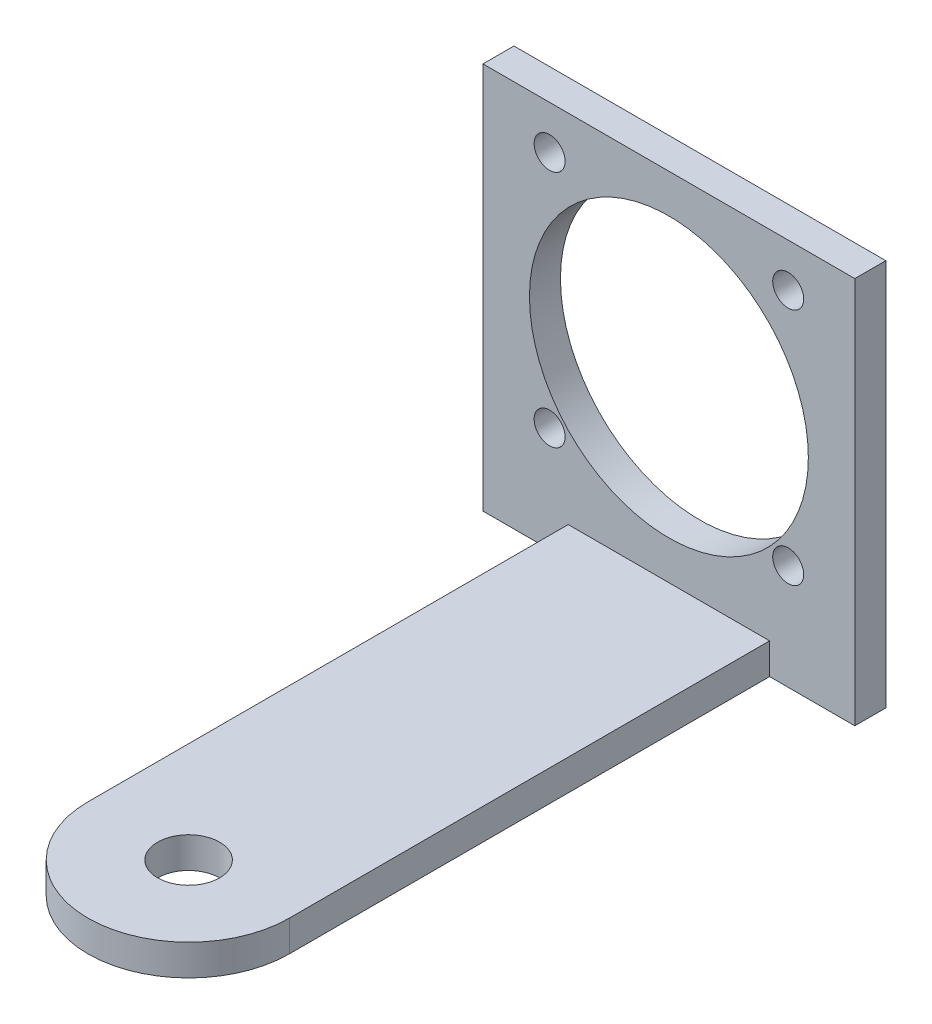
ISO-10303-21;
HEADER;
FILE_DESCRIPTION(('STEP AP214'),'2;1');
FILE_NAME('part.step','',(''),(''),'','','');
FILE_SCHEMA(('AUTOMOTIVE_DESIGN { 1 0 10303 214 1 1 1 1 }'));
ENDSEC;
DATA;
#1=APPLICATION_CONTEXT('core data for automotive mechanical design processes');
#2=APPLICATION_PROTOCOL_DEFINITION('international standard','automotive_design',2000,#1);
#3=PRODUCT_CONTEXT('',#1,'mechanical');
#4=PRODUCT('Part','Part','',(#3));
#5=PRODUCT_RELATED_PRODUCT_CATEGORY('part','',(#4));
#6=PRODUCT_DEFINITION_FORMATION('','',#4);
#7=PRODUCT_DEFINITION_CONTEXT('part definition',#1,'design');
#8=PRODUCT_DEFINITION('design','',#6,#7);
#9=PRODUCT_DEFINITION_SHAPE('','',#8);
#10=(LENGTH_UNIT() NAMED_UNIT(*) SI_UNIT(.MILLI.,.METRE.));
#11=(NAMED_UNIT(*) PLANE_ANGLE_UNIT() SI_UNIT($,.RADIAN.));
#12=(NAMED_UNIT(*) SI_UNIT($,.STERADIAN.) SOLID_ANGLE_UNIT());
#13=UNCERTAINTY_MEASURE_WITH_UNIT(LENGTH_MEASURE(1.E-05),#10,'distance_accuracy_value','');
#14=(GEOMETRIC_REPRESENTATION_CONTEXT(3) GLOBAL_UNCERTAINTY_ASSIGNED_CONTEXT((#13)) GLOBAL_UNIT_ASSIGNED_CONTEXT((#10,
#11,#12)) REPRESENTATION_CONTEXT('',''));
#15=CARTESIAN_POINT('',(0.,0.,0.));
#16=DIRECTION('',(0.,0.,1.));
#17=DIRECTION('',(1.,0.,0.));
#18=AXIS2_PLACEMENT_3D('',#15,#16,#17);
#19=CARTESIAN_POINT('',(0.,2.,0.));
#20=DIRECTION('',(0.,-1.,0.));
#21=DIRECTION('',(0.,0.,-1.));
#22=AXIS2_PLACEMENT_3D('',#19,#20,#21);
#23=CYLINDRICAL_SURFACE('',#22,6.5);
#24=DIRECTION('',(0.,1.,0.));
#25=VECTOR('',#24,1.);
#26=CARTESIAN_POINT('',(6.5,0.,0.));
#27=LINE('',#26,#25);
#28=CARTESIAN_POINT('',(6.5,0.,0.));
#29=VERTEX_POINT('',#28);
#30=CARTESIAN_POINT('',(6.5,2.,0.));
#31=VERTEX_POINT('',#30);
#32=EDGE_CURVE('E85',#29,#31,#27,.T.);
#33=ORIENTED_EDGE('',*,*,#32,.T.);
#34=CARTESIAN_POINT('',(0.,2.,0.));
#35=DIRECTION('',(0.,1.,0.));
#36=DIRECTION('',(0.,0.,1.));
#37=AXIS2_PLACEMENT_3D('',#34,#35,#36);
#38=CIRCLE('',#37,6.5);
#39=CARTESIAN_POINT('',(-6.5,2.,0.));
#40=VERTEX_POINT('',#39);
#41=EDGE_CURVE('E12',#40,#31,#38,.T.);
#42=ORIENTED_EDGE('',*,*,#41,.F.);
#43=DIRECTION('',(0.,1.,0.));
#44=VECTOR('',#43,1.);
#45=CARTESIAN_POINT('',(-6.5,0.,0.));
#46=LINE('',#45,#44);
#47=CARTESIAN_POINT('',(-6.5,0.,0.));
#48=VERTEX_POINT('',#47);
#49=EDGE_CURVE('E211',#48,#40,#46,.T.);
#50=ORIENTED_EDGE('',*,*,#49,.F.);
#51=CARTESIAN_POINT('',(0.,0.,0.));
#52=DIRECTION('',(0.,1.,0.));
#53=DIRECTION('',(0.,0.,1.));
#54=AXIS2_PLACEMENT_3D('',#51,#52,#53);
#55=CIRCLE('',#54,6.5);
#56=EDGE_CURVE('E70',#48,#29,#55,.T.);
#57=ORIENTED_EDGE('',*,*,#56,.T.);
#58=EDGE_LOOP('',(#33,#42,#50,#57));
#59=FACE_BOUND('',#58,.T.);
#60=ADVANCED_FACE('F67',(#59),#23,.T.);
#61=CARTESIAN_POINT('',(0.,2.,0.));
#62=DIRECTION('',(0.,1.,0.));
#63=DIRECTION('',(0.,0.,1.));
#64=AXIS2_PLACEMENT_3D('',#61,#62,#63);
#65=PLANE('',#64);
#66=CARTESIAN_POINT('',(0.,2.,0.));
#67=DIRECTION('',(0.,1.,0.));
#68=DIRECTION('',(0.,0.,1.));
#69=AXIS2_PLACEMENT_3D('',#66,#67,#68);
#70=CIRCLE('',#69,2.);
#71=CARTESIAN_POINT('',(0.,2.,2.));
#72=VERTEX_POINT('',#71);
#73=EDGE_CURVE('E208',#72,#72,#70,.T.);
#74=ORIENTED_EDGE('',*,*,#73,.F.);
#75=EDGE_LOOP('',(#74));
#76=FACE_BOUND('',#75,.T.);
#77=ORIENTED_EDGE('',*,*,#41,.T.);
#78=DIRECTION('',(0.,0.,-1.));
#79=VECTOR('',#78,1.);
#80=CARTESIAN_POINT('',(6.5,2.,0.));
#81=LINE('',#80,#79);
#82=CARTESIAN_POINT('',(6.5,2.,-31.));
#83=VERTEX_POINT('',#82);
#84=EDGE_CURVE('E191',#31,#83,#81,.T.);
#85=ORIENTED_EDGE('',*,*,#84,.T.);
#86=DIRECTION('',(1.,0.,0.));
#87=VECTOR('',#86,1.);
#88=CARTESIAN_POINT('',(0.,2.,-31.));
#89=LINE('',#88,#87);
#90=CARTESIAN_POINT('',(-6.5,2.,-31.));
#91=VERTEX_POINT('',#90);
#92=EDGE_CURVE('E150',#91,#83,#89,.T.);
#93=ORIENTED_EDGE('',*,*,#92,.F.);
#94=DIRECTION('',(0.,0.,-1.));
#95=VECTOR('',#94,1.);
#96=CARTESIAN_POINT('',(-6.5,2.,0.));
#97=LINE('',#96,#95);
#98=EDGE_CURVE('E198',#40,#91,#97,.T.);
#99=ORIENTED_EDGE('',*,*,#98,.F.);
#100=EDGE_LOOP('',(#77,#85,#93,#99));
#101=FACE_BOUND('',#100,.T.);
#102=ADVANCED_FACE('F227',(#76,#101),#65,.T.);
#103=CARTESIAN_POINT('',(0.,0.,0.));
#104=DIRECTION('',(0.,1.,0.));
#105=DIRECTION('',(0.,0.,1.));
#106=AXIS2_PLACEMENT_3D('',#103,#104,#105);
#107=PLANE('',#106);
#108=CARTESIAN_POINT('',(0.,0.,0.));
#109=DIRECTION('',(0.,1.,0.));
#110=DIRECTION('',(0.,0.,1.));
#111=AXIS2_PLACEMENT_3D('',#108,#109,#110);
#112=CIRCLE('',#111,2.);
#113=CARTESIAN_POINT('',(0.,0.,2.));
#114=VERTEX_POINT('',#113);
#115=EDGE_CURVE('E217',#114,#114,#112,.T.);
#116=ORIENTED_EDGE('',*,*,#115,.T.);
#117=EDGE_LOOP('',(#116));
#118=FACE_BOUND('',#117,.T.);
#119=ORIENTED_EDGE('',*,*,#56,.F.);
#120=DIRECTION('',(0.,0.,-1.));
#121=VECTOR('',#120,1.);
#122=CARTESIAN_POINT('',(-6.5,0.,0.));
#123=LINE('',#122,#121);
#124=CARTESIAN_POINT('',(-6.5,0.,-31.));
#125=VERTEX_POINT('',#124);
#126=EDGE_CURVE('E187',#48,#125,#123,.T.);
#127=ORIENTED_EDGE('',*,*,#126,.T.);
#128=DIRECTION('',(-1.,0.,0.));
#129=VECTOR('',#128,1.);
#130=CARTESIAN_POINT('',(0.,0.,-31.));
#131=LINE('',#130,#129);
#132=CARTESIAN_POINT('',(-12.,0.,-31.));
#133=VERTEX_POINT('',#132);
#134=EDGE_CURVE('E146',#125,#133,#131,.T.);
#135=ORIENTED_EDGE('',*,*,#134,.T.);
#136=DIRECTION('',(0.,0.,1.));
#137=VECTOR('',#136,1.);
#138=CARTESIAN_POINT('',(-12.,0.,-33.));
#139=LINE('',#138,#137);
#140=CARTESIAN_POINT('',(-12.,0.,-33.));
#141=VERTEX_POINT('',#140);
#142=EDGE_CURVE('E143',#141,#133,#139,.T.);
#143=ORIENTED_EDGE('',*,*,#142,.F.);
#144=DIRECTION('',(-1.,0.,0.));
#145=VECTOR('',#144,1.);
#146=CARTESIAN_POINT('',(12.,0.,-33.));
#147=LINE('',#146,#145);
#148=CARTESIAN_POINT('',(12.,0.,-33.));
#149=VERTEX_POINT('',#148);
#150=EDGE_CURVE('E128',#149,#141,#147,.T.);
#151=ORIENTED_EDGE('',*,*,#150,.F.);
#152=DIRECTION('',(0.,0.,1.));
#153=VECTOR('',#152,1.);
#154=CARTESIAN_POINT('',(12.,0.,-33.));
#155=LINE('',#154,#153);
#156=CARTESIAN_POINT('',(12.,0.,-31.));
#157=VERTEX_POINT('',#156);
#158=EDGE_CURVE('E165',#149,#157,#155,.T.);
#159=ORIENTED_EDGE('',*,*,#158,.T.);
#160=CARTESIAN_POINT('',(6.5,0.,-31.));
#161=VERTEX_POINT('',#160);
#162=EDGE_CURVE('E166',#157,#161,#131,.T.);
#163=ORIENTED_EDGE('',*,*,#162,.T.);
#164=DIRECTION('',(0.,0.,-1.));
#165=VECTOR('',#164,1.);
#166=CARTESIAN_POINT('',(6.5,0.,0.));
#167=LINE('',#166,#165);
#168=EDGE_CURVE('E190',#29,#161,#167,.T.);
#169=ORIENTED_EDGE('',*,*,#168,.F.);
#170=EDGE_LOOP('',(#119,#127,#135,#143,#151,#159,#163,#169));
#171=FACE_BOUND('',#170,.T.);
#172=ADVANCED_FACE('F144',(#118,#171),#107,.F.);
#173=CARTESIAN_POINT('',(0.,0.,0.));
#174=DIRECTION('',(0.,1.,0.));
#175=DIRECTION('',(0.,0.,1.));
#176=AXIS2_PLACEMENT_3D('',#173,#174,#175);
#177=CYLINDRICAL_SURFACE('',#176,2.);
#178=ORIENTED_EDGE('',*,*,#115,.F.);
#179=EDGE_LOOP('',(#178));
#180=FACE_BOUND('',#179,.T.);
#181=ORIENTED_EDGE('',*,*,#73,.T.);
#182=EDGE_LOOP('',(#181));
#183=FACE_BOUND('',#182,.T.);
#184=ADVANCED_FACE('F225',(#180,#183),#177,.F.);
#185=CARTESIAN_POINT('',(6.5,0.,0.));
#186=DIRECTION('',(1.,0.,0.));
#187=DIRECTION('',(0.,0.,-1.));
#188=AXIS2_PLACEMENT_3D('',#185,#186,#187);
#189=PLANE('',#188);
#190=ORIENTED_EDGE('',*,*,#84,.F.);
#191=ORIENTED_EDGE('',*,*,#32,.F.);
#192=ORIENTED_EDGE('',*,*,#168,.T.);
#193=DIRECTION('',(0.,1.,0.));
#194=VECTOR('',#193,1.);
#195=CARTESIAN_POINT('',(6.5,0.,-31.));
#196=LINE('',#195,#194);
#197=EDGE_CURVE('E205',#161,#83,#196,.T.);
#198=ORIENTED_EDGE('',*,*,#197,.T.);
#199=EDGE_LOOP('',(#190,#191,#192,#198));
#200=FACE_BOUND('',#199,.T.);
#201=ADVANCED_FACE('F234',(#200),#189,.T.);
#202=CARTESIAN_POINT('',(-6.5,0.,0.));
#203=DIRECTION('',(1.,0.,0.));
#204=DIRECTION('',(0.,0.,-1.));
#205=AXIS2_PLACEMENT_3D('',#202,#203,#204);
#206=PLANE('',#205);
#207=ORIENTED_EDGE('',*,*,#98,.T.);
#208=DIRECTION('',(0.,1.,0.));
#209=VECTOR('',#208,1.);
#210=CARTESIAN_POINT('',(-6.5,0.,-31.));
#211=LINE('',#210,#209);
#212=EDGE_CURVE('E194',#125,#91,#211,.T.);
#213=ORIENTED_EDGE('',*,*,#212,.F.);
#214=ORIENTED_EDGE('',*,*,#126,.F.);
#215=ORIENTED_EDGE('',*,*,#49,.T.);
#216=EDGE_LOOP('',(#207,#213,#214,#215));
#217=FACE_BOUND('',#216,.T.);
#218=ADVANCED_FACE('F253',(#217),#206,.F.);
#219=CARTESIAN_POINT('',(-12.,0.,-33.));
#220=DIRECTION('',(1.,0.,0.));
#221=DIRECTION('',(0.,0.,-1.));
#222=AXIS2_PLACEMENT_3D('',#219,#220,#221);
#223=PLANE('',#222);
#224=DIRECTION('',(0.,1.,0.));
#225=VECTOR('',#224,1.);
#226=CARTESIAN_POINT('',(-12.,0.,-31.));
#227=LINE('',#226,#225);
#228=CARTESIAN_POINT('',(-12.,25.,-31.));
#229=VERTEX_POINT('',#228);
#230=EDGE_CURVE('E170',#133,#229,#227,.T.);
#231=ORIENTED_EDGE('',*,*,#230,.T.);
#232=DIRECTION('',(0.,0.,1.));
#233=VECTOR('',#232,1.);
#234=CARTESIAN_POINT('',(-12.,25.,-33.));
#235=LINE('',#234,#233);
#236=CARTESIAN_POINT('',(-12.,25.,-33.));
#237=VERTEX_POINT('',#236);
#238=EDGE_CURVE('E151',#237,#229,#235,.T.);
#239=ORIENTED_EDGE('',*,*,#238,.F.);
#240=DIRECTION('',(0.,1.,0.));
#241=VECTOR('',#240,1.);
#242=CARTESIAN_POINT('',(-12.,0.,-33.));
#243=LINE('',#242,#241);
#244=EDGE_CURVE('E132',#141,#237,#243,.T.);
#245=ORIENTED_EDGE('',*,*,#244,.F.);
#246=ORIENTED_EDGE('',*,*,#142,.T.);
#247=EDGE_LOOP('',(#231,#239,#245,#246));
#248=FACE_BOUND('',#247,.T.);
#249=ADVANCED_FACE('F153',(#248),#223,.F.);
#250=CARTESIAN_POINT('',(-12.,25.,-33.));
#251=DIRECTION('',(0.,-1.,0.));
#252=DIRECTION('',(1.,0.,0.));
#253=AXIS2_PLACEMENT_3D('',#250,#251,#252);
#254=PLANE('',#253);
#255=DIRECTION('',(1.,0.,0.));
#256=VECTOR('',#255,1.);
#257=CARTESIAN_POINT('',(-12.,25.,-31.));
#258=LINE('',#257,#256);
#259=CARTESIAN_POINT('',(12.,25.,-31.));
#260=VERTEX_POINT('',#259);
#261=EDGE_CURVE('E173',#229,#260,#258,.T.);
#262=ORIENTED_EDGE('',*,*,#261,.T.);
#263=DIRECTION('',(0.,0.,1.));
#264=VECTOR('',#263,1.);
#265=CARTESIAN_POINT('',(12.,25.,-33.));
#266=LINE('',#265,#264);
#267=CARTESIAN_POINT('',(12.,25.,-33.));
#268=VERTEX_POINT('',#267);
#269=EDGE_CURVE('E181',#268,#260,#266,.T.);
#270=ORIENTED_EDGE('',*,*,#269,.F.);
#271=DIRECTION('',(1.,0.,0.));
#272=VECTOR('',#271,1.);
#273=CARTESIAN_POINT('',(-12.,25.,-33.));
#274=LINE('',#273,#272);
#275=EDGE_CURVE('E157',#237,#268,#274,.T.);
#276=ORIENTED_EDGE('',*,*,#275,.F.);
#277=ORIENTED_EDGE('',*,*,#238,.T.);
#278=EDGE_LOOP('',(#262,#270,#276,#277));
#279=FACE_BOUND('',#278,.T.);
#280=ADVANCED_FACE('F245',(#279),#254,.F.);
#281=CARTESIAN_POINT('',(12.,25.,-33.));
#282=DIRECTION('',(-1.,0.,0.));
#283=DIRECTION('',(0.,0.,1.));
#284=AXIS2_PLACEMENT_3D('',#281,#282,#283);
#285=PLANE('',#284);
#286=DIRECTION('',(0.,-1.,0.));
#287=VECTOR('',#286,1.);
#288=CARTESIAN_POINT('',(12.,25.,-31.));
#289=LINE('',#288,#287);
#290=EDGE_CURVE('E140',#260,#157,#289,.T.);
#291=ORIENTED_EDGE('',*,*,#290,.T.);
#292=ORIENTED_EDGE('',*,*,#158,.F.);
#293=DIRECTION('',(0.,-1.,0.));
#294=VECTOR('',#293,1.);
#295=CARTESIAN_POINT('',(12.,25.,-33.));
#296=LINE('',#295,#294);
#297=EDGE_CURVE('E135',#268,#149,#296,.T.);
#298=ORIENTED_EDGE('',*,*,#297,.F.);
#299=ORIENTED_EDGE('',*,*,#269,.T.);
#300=EDGE_LOOP('',(#291,#292,#298,#299));
#301=FACE_BOUND('',#300,.T.);
#302=ADVANCED_FACE('F241',(#301),#285,.F.);
#303=CARTESIAN_POINT('',(0.,0.,-33.));
#304=DIRECTION('',(0.,0.,-1.));
#305=DIRECTION('',(-1.,0.,0.));
#306=AXIS2_PLACEMENT_3D('',#303,#304,#305);
#307=PLANE('',#306);
#308=CARTESIAN_POINT('',(-7.7,22.2,-33.));
#309=DIRECTION('',(0.,0.,1.));
#310=DIRECTION('',(1.,0.,0.));
#311=AXIS2_PLACEMENT_3D('',#308,#309,#310);
#312=CIRCLE('',#311,1.);
#313=CARTESIAN_POINT('',(-6.7,22.2,-33.));
#314=VERTEX_POINT('',#313);
#315=EDGE_CURVE('E377',#314,#314,#312,.T.);
#316=ORIENTED_EDGE('',*,*,#315,.T.);
#317=EDGE_LOOP('',(#316));
#318=FACE_BOUND('',#317,.T.);
#319=CARTESIAN_POINT('',(7.7,22.2,-33.));
#320=DIRECTION('',(0.,0.,1.));
#321=DIRECTION('',(1.,0.,0.));
#322=AXIS2_PLACEMENT_3D('',#319,#320,#321);
#323=CIRCLE('',#322,1.);
#324=CARTESIAN_POINT('',(8.7,22.2,-33.));
#325=VERTEX_POINT('',#324);
#326=EDGE_CURVE('E382',#325,#325,#323,.T.);
#327=ORIENTED_EDGE('',*,*,#326,.T.);
#328=EDGE_LOOP('',(#327));
#329=FACE_BOUND('',#328,.T.);
#330=CARTESIAN_POINT('',(7.7,6.8,-33.));
#331=DIRECTION('',(0.,0.,1.));
#332=DIRECTION('',(1.,0.,0.));
#333=AXIS2_PLACEMENT_3D('',#330,#331,#332);
#334=CIRCLE('',#333,1.);
#335=CARTESIAN_POINT('',(8.7,6.8,-33.));
#336=VERTEX_POINT('',#335);
#337=EDGE_CURVE('E415',#336,#336,#334,.T.);
#338=ORIENTED_EDGE('',*,*,#337,.T.);
#339=EDGE_LOOP('',(#338));
#340=FACE_BOUND('',#339,.T.);
#341=CARTESIAN_POINT('',(-7.7,6.8,-33.));
#342=DIRECTION('',(0.,0.,1.));
#343=DIRECTION('',(1.,0.,0.));
#344=AXIS2_PLACEMENT_3D('',#341,#342,#343);
#345=CIRCLE('',#344,1.);
#346=CARTESIAN_POINT('',(-6.7,6.8,-33.));
#347=VERTEX_POINT('',#346);
#348=EDGE_CURVE('E403',#347,#347,#345,.T.);
#349=ORIENTED_EDGE('',*,*,#348,.T.);
#350=EDGE_LOOP('',(#349));
#351=FACE_BOUND('',#350,.T.);
#352=CARTESIAN_POINT('',(0.,13.5,-33.));
#353=DIRECTION('',(0.,0.,1.));
#354=DIRECTION('',(1.,0.,0.));
#355=AXIS2_PLACEMENT_3D('',#352,#353,#354);
#356=CIRCLE('',#355,9.);
#357=CARTESIAN_POINT('',(9.,13.5,-33.));
#358=VERTEX_POINT('',#357);
#359=EDGE_CURVE('E392',#358,#358,#356,.T.);
#360=ORIENTED_EDGE('',*,*,#359,.T.);
#361=EDGE_LOOP('',(#360));
#362=FACE_BOUND('',#361,.T.);
#363=ORIENTED_EDGE('',*,*,#150,.T.);
#364=ORIENTED_EDGE('',*,*,#244,.T.);
#365=ORIENTED_EDGE('',*,*,#275,.T.);
#366=ORIENTED_EDGE('',*,*,#297,.T.);
#367=EDGE_LOOP('',(#363,#364,#365,#366));
#368=FACE_BOUND('',#367,.T.);
#369=ADVANCED_FACE('F130',(#318,#329,#340,#351,#362,#368),#307,.T.);
#370=CARTESIAN_POINT('',(0.,0.,-31.));
#371=DIRECTION('',(0.,0.,-1.));
#372=DIRECTION('',(-1.,0.,0.));
#373=AXIS2_PLACEMENT_3D('',#370,#371,#372);
#374=PLANE('',#373);
#375=CARTESIAN_POINT('',(-7.7,22.2,-31.));
#376=DIRECTION('',(0.,0.,1.));
#377=DIRECTION('',(1.,0.,0.));
#378=AXIS2_PLACEMENT_3D('',#375,#376,#377);
#379=CIRCLE('',#378,1.);
#380=CARTESIAN_POINT('',(-6.7,22.2,-31.));
#381=VERTEX_POINT('',#380);
#382=EDGE_CURVE('E380',#381,#381,#379,.T.);
#383=ORIENTED_EDGE('',*,*,#382,.F.);
#384=EDGE_LOOP('',(#383));
#385=FACE_BOUND('',#384,.T.);
#386=CARTESIAN_POINT('',(7.7,22.2,-31.));
#387=DIRECTION('',(0.,0.,1.));
#388=DIRECTION('',(1.,0.,0.));
#389=AXIS2_PLACEMENT_3D('',#386,#387,#388);
#390=CIRCLE('',#389,1.);
#391=CARTESIAN_POINT('',(8.7,22.2,-31.));
#392=VERTEX_POINT('',#391);
#393=EDGE_CURVE('E387',#392,#392,#390,.T.);
#394=ORIENTED_EDGE('',*,*,#393,.F.);
#395=EDGE_LOOP('',(#394));
#396=FACE_BOUND('',#395,.T.);
#397=CARTESIAN_POINT('',(7.7,6.8,-31.));
#398=DIRECTION('',(0.,0.,1.));
#399=DIRECTION('',(1.,0.,0.));
#400=AXIS2_PLACEMENT_3D('',#397,#398,#399);
#401=CIRCLE('',#400,1.);
#402=CARTESIAN_POINT('',(8.7,6.8,-31.));
#403=VERTEX_POINT('',#402);
#404=EDGE_CURVE('E409',#403,#403,#401,.T.);
#405=ORIENTED_EDGE('',*,*,#404,.F.);
#406=EDGE_LOOP('',(#405));
#407=FACE_BOUND('',#406,.T.);
#408=CARTESIAN_POINT('',(-7.7,6.8,-31.));
#409=DIRECTION('',(0.,0.,1.));
#410=DIRECTION('',(1.,0.,0.));
#411=AXIS2_PLACEMENT_3D('',#408,#409,#410);
#412=CIRCLE('',#411,1.);
#413=CARTESIAN_POINT('',(-6.7,6.8,-31.));
#414=VERTEX_POINT('',#413);
#415=EDGE_CURVE('E398',#414,#414,#412,.T.);
#416=ORIENTED_EDGE('',*,*,#415,.F.);
#417=EDGE_LOOP('',(#416));
#418=FACE_BOUND('',#417,.T.);
#419=CARTESIAN_POINT('',(0.,13.5,-31.));
#420=DIRECTION('',(0.,0.,1.));
#421=DIRECTION('',(1.,0.,0.));
#422=AXIS2_PLACEMENT_3D('',#419,#420,#421);
#423=CIRCLE('',#422,9.);
#424=CARTESIAN_POINT('',(9.,13.5,-31.));
#425=VERTEX_POINT('',#424);
#426=EDGE_CURVE('E395',#425,#425,#423,.T.);
#427=ORIENTED_EDGE('',*,*,#426,.F.);
#428=EDGE_LOOP('',(#427));
#429=FACE_BOUND('',#428,.T.);
#430=ORIENTED_EDGE('',*,*,#197,.F.);
#431=ORIENTED_EDGE('',*,*,#162,.F.);
#432=ORIENTED_EDGE('',*,*,#290,.F.);
#433=ORIENTED_EDGE('',*,*,#261,.F.);
#434=ORIENTED_EDGE('',*,*,#230,.F.);
#435=ORIENTED_EDGE('',*,*,#134,.F.);
#436=ORIENTED_EDGE('',*,*,#212,.T.);
#437=ORIENTED_EDGE('',*,*,#92,.T.);
#438=EDGE_LOOP('',(#430,#431,#432,#433,#434,#435,#436,#437));
#439=FACE_BOUND('',#438,.T.);
#440=ADVANCED_FACE('F238',(#385,#396,#407,#418,#429,#439),#374,.F.);
#441=CARTESIAN_POINT('',(0.,13.5,-33.));
#442=DIRECTION('',(0.,0.,1.));
#443=DIRECTION('',(1.,0.,0.));
#444=AXIS2_PLACEMENT_3D('',#441,#442,#443);
#445=CYLINDRICAL_SURFACE('',#444,9.);
#446=ORIENTED_EDGE('',*,*,#359,.F.);
#447=EDGE_LOOP('',(#446));
#448=FACE_BOUND('',#447,.T.);
#449=ORIENTED_EDGE('',*,*,#426,.T.);
#450=EDGE_LOOP('',(#449));
#451=FACE_BOUND('',#450,.T.);
#452=ADVANCED_FACE('F320',(#448,#451),#445,.F.);
#453=CARTESIAN_POINT('',(-7.7,6.8,-33.));
#454=DIRECTION('',(0.,0.,1.));
#455=DIRECTION('',(1.,0.,0.));
#456=AXIS2_PLACEMENT_3D('',#453,#454,#455);
#457=CYLINDRICAL_SURFACE('',#456,1.);
#458=ORIENTED_EDGE('',*,*,#348,.F.);
#459=EDGE_LOOP('',(#458));
#460=FACE_BOUND('',#459,.T.);
#461=ORIENTED_EDGE('',*,*,#415,.T.);
#462=EDGE_LOOP('',(#461));
#463=FACE_BOUND('',#462,.T.);
#464=ADVANCED_FACE('F330',(#460,#463),#457,.F.);
#465=CARTESIAN_POINT('',(7.7,6.8,-33.));
#466=DIRECTION('',(0.,0.,1.));
#467=DIRECTION('',(1.,0.,0.));
#468=AXIS2_PLACEMENT_3D('',#465,#466,#467);
#469=CYLINDRICAL_SURFACE('',#468,1.);
#470=ORIENTED_EDGE('',*,*,#337,.F.);
#471=EDGE_LOOP('',(#470));
#472=FACE_BOUND('',#471,.T.);
#473=ORIENTED_EDGE('',*,*,#404,.T.);
#474=EDGE_LOOP('',(#473));
#475=FACE_BOUND('',#474,.T.);
#476=ADVANCED_FACE('F340',(#472,#475),#469,.F.);
#477=CARTESIAN_POINT('',(7.7,22.2,-33.));
#478=DIRECTION('',(0.,0.,1.));
#479=DIRECTION('',(1.,0.,0.));
#480=AXIS2_PLACEMENT_3D('',#477,#478,#479);
#481=CYLINDRICAL_SURFACE('',#480,1.);
#482=ORIENTED_EDGE('',*,*,#326,.F.);
#483=EDGE_LOOP('',(#482));
#484=FACE_BOUND('',#483,.T.);
#485=ORIENTED_EDGE('',*,*,#393,.T.);
#486=EDGE_LOOP('',(#485));
#487=FACE_BOUND('',#486,.T.);
#488=ADVANCED_FACE('F350',(#484,#487),#481,.F.);
#489=CARTESIAN_POINT('',(-7.7,22.2,-33.));
#490=DIRECTION('',(0.,0.,1.));
#491=DIRECTION('',(1.,0.,0.));
#492=AXIS2_PLACEMENT_3D('',#489,#490,#491);
#493=CYLINDRICAL_SURFACE('',#492,1.);
#494=ORIENTED_EDGE('',*,*,#315,.F.);
#495=EDGE_LOOP('',(#494));
#496=FACE_BOUND('',#495,.T.);
#497=ORIENTED_EDGE('',*,*,#382,.T.);
#498=EDGE_LOOP('',(#497));
#499=FACE_BOUND('',#498,.T.);
#500=ADVANCED_FACE('F360',(#496,#499),#493,.F.);
#501=CLOSED_SHELL('',(#60,#102,#172,#184,#201,#218,#249,#280,#302,#369,#440,#452,#464,#476,#488,#500));
#502=MANIFOLD_SOLID_BREP('B2',#501);
#503=ADVANCED_BREP_SHAPE_REPRESENTATION('',(#18,#502),#14);
#504=SHAPE_DEFINITION_REPRESENTATION(#9,#503);
ENDSEC;
END-ISO-10303-21;
